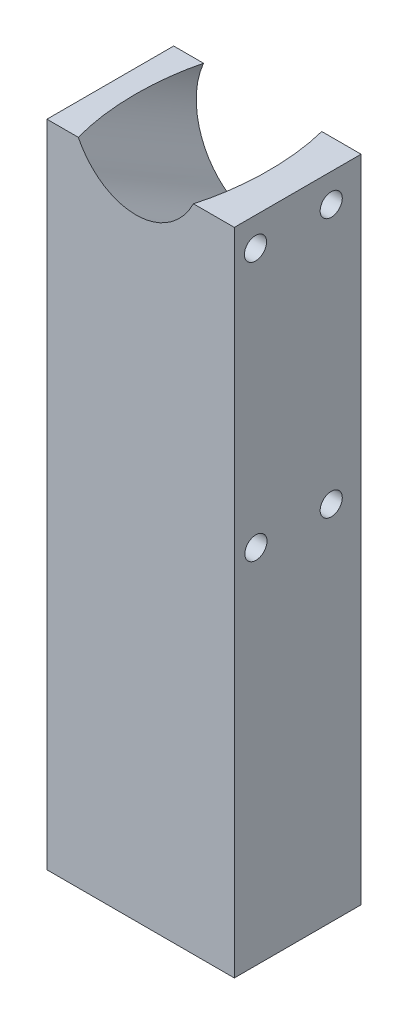
ISO-10303-21;
HEADER;
FILE_DESCRIPTION(('STEP AP214'),'2;1');
FILE_NAME('part.step','',(''),(''),'','','');
FILE_SCHEMA(('AUTOMOTIVE_DESIGN { 1 0 10303 214 1 1 1 1 }'));
ENDSEC;
DATA;
#1=APPLICATION_CONTEXT('core data for automotive mechanical design processes');
#2=APPLICATION_PROTOCOL_DEFINITION('international standard','automotive_design',2000,#1);
#3=PRODUCT_CONTEXT('',#1,'mechanical');
#4=PRODUCT('Part','Part','',(#3));
#5=PRODUCT_RELATED_PRODUCT_CATEGORY('part','',(#4));
#6=PRODUCT_DEFINITION_FORMATION('','',#4);
#7=PRODUCT_DEFINITION_CONTEXT('part definition',#1,'design');
#8=PRODUCT_DEFINITION('design','',#6,#7);
#9=PRODUCT_DEFINITION_SHAPE('','',#8);
#10=(LENGTH_UNIT() NAMED_UNIT(*) SI_UNIT(.MILLI.,.METRE.));
#11=(NAMED_UNIT(*) PLANE_ANGLE_UNIT() SI_UNIT($,.RADIAN.));
#12=(NAMED_UNIT(*) SI_UNIT($,.STERADIAN.) SOLID_ANGLE_UNIT());
#13=UNCERTAINTY_MEASURE_WITH_UNIT(LENGTH_MEASURE(1.E-05),#10,'distance_accuracy_value','');
#14=(GEOMETRIC_REPRESENTATION_CONTEXT(3) GLOBAL_UNCERTAINTY_ASSIGNED_CONTEXT((#13)) GLOBAL_UNIT_ASSIGNED_CONTEXT((#10,
#11,#12)) REPRESENTATION_CONTEXT('',''));
#15=CARTESIAN_POINT('',(0.,0.,0.));
#16=DIRECTION('',(0.,0.,1.));
#17=DIRECTION('',(1.,0.,0.));
#18=AXIS2_PLACEMENT_3D('',#15,#16,#17);
#19=CARTESIAN_POINT('',(4691.55444195582,-4349.73956554871,53.2520183883639));
#20=DIRECTION('',(-1.,0.,0.));
#21=DIRECTION('',(0.,1.,0.));
#22=AXIS2_PLACEMENT_3D('',#19,#20,#21);
#23=PLANE('',#22);
#24=CARTESIAN_POINT('',(4691.55444195582,-4349.73956554871,53.2520183883639));
#25=DIRECTION('',(1.,0.,0.));
#26=DIRECTION('',(0.,1.,0.));
#27=AXIS2_PLACEMENT_3D('',#24,#25,#26);
#28=CIRCLE('',#27,1.50000000000031);
#29=CARTESIAN_POINT('',(4691.55444195582,-4348.23956554871,53.2520183883639));
#30=VERTEX_POINT('',#29);
#31=EDGE_CURVE('E145',#30,#30,#28,.T.);
#32=ORIENTED_EDGE('',*,*,#31,.F.);
#33=EDGE_LOOP('',(#32));
#34=FACE_BOUND('',#33,.T.);
#35=ADVANCED_FACE('F34',(#34),#23,.T.);
#36=CARTESIAN_POINT('',(4691.55444195582,-4349.73956554871,43.0468273602777));
#37=DIRECTION('',(-1.,0.,0.));
#38=DIRECTION('',(0.,1.,0.));
#39=AXIS2_PLACEMENT_3D('',#36,#37,#38);
#40=PLANE('',#39);
#41=CARTESIAN_POINT('',(4691.55444195582,-4349.73956554871,43.0468273602777));
#42=DIRECTION('',(1.,0.,0.));
#43=DIRECTION('',(0.,1.,0.));
#44=AXIS2_PLACEMENT_3D('',#41,#42,#43);
#45=CIRCLE('',#44,1.50000000000004);
#46=CARTESIAN_POINT('',(4691.55444195582,-4348.23956554871,43.0468273602777));
#47=VERTEX_POINT('',#46);
#48=EDGE_CURVE('E99',#47,#47,#45,.T.);
#49=ORIENTED_EDGE('',*,*,#48,.F.);
#50=EDGE_LOOP('',(#49));
#51=FACE_BOUND('',#50,.T.);
#52=ADVANCED_FACE('F194',(#51),#40,.T.);
#53=CARTESIAN_POINT('',(4696.55444195582,-4384.90256348358,53.2520183883639));
#54=DIRECTION('',(-1.,0.,0.));
#55=DIRECTION('',(0.,1.,0.));
#56=AXIS2_PLACEMENT_3D('',#53,#54,#55);
#57=PLANE('',#56);
#58=CARTESIAN_POINT('',(4696.55444195582,-4384.90256348358,53.2520183883639));
#59=DIRECTION('',(1.,0.,0.));
#60=DIRECTION('',(0.,1.,0.));
#61=AXIS2_PLACEMENT_3D('',#58,#59,#60);
#62=CIRCLE('',#61,1.49999999999993);
#63=CARTESIAN_POINT('',(4696.55444195582,-4383.40256348358,53.2520183883639));
#64=VERTEX_POINT('',#63);
#65=EDGE_CURVE('E128',#64,#64,#62,.T.);
#66=ORIENTED_EDGE('',*,*,#65,.F.);
#67=EDGE_LOOP('',(#66));
#68=FACE_BOUND('',#67,.T.);
#69=ADVANCED_FACE('F196',(#68),#57,.T.);
#70=CARTESIAN_POINT('',(4696.55444195582,-4384.90256348358,43.0468273602777));
#71=DIRECTION('',(-1.,0.,0.));
#72=DIRECTION('',(0.,1.,0.));
#73=AXIS2_PLACEMENT_3D('',#70,#71,#72);
#74=PLANE('',#73);
#75=CARTESIAN_POINT('',(4696.55444195582,-4384.90256348358,43.0468273602777));
#76=DIRECTION('',(1.,0.,0.));
#77=DIRECTION('',(0.,1.,0.));
#78=AXIS2_PLACEMENT_3D('',#75,#76,#77);
#79=CIRCLE('',#78,1.50000000000008);
#80=CARTESIAN_POINT('',(4696.55444195582,-4383.40256348358,43.0468273602777));
#81=VERTEX_POINT('',#80);
#82=EDGE_CURVE('E161',#81,#81,#79,.T.);
#83=ORIENTED_EDGE('',*,*,#82,.F.);
#84=EDGE_LOOP('',(#83));
#85=FACE_BOUND('',#84,.T.);
#86=ADVANCED_FACE('F202',(#85),#74,.T.);
#87=CARTESIAN_POINT('',(4710.95444195582,-4349.73956554871,53.3144563773744));
#88=DIRECTION('',(1.,0.,0.));
#89=DIRECTION('',(0.,-1.,0.));
#90=AXIS2_PLACEMENT_3D('',#87,#88,#89);
#91=PLANE('',#90);
#92=CARTESIAN_POINT('',(4710.95444195582,-4349.73956554871,53.3144563773744));
#93=DIRECTION('',(-1.,0.,0.));
#94=DIRECTION('',(0.,-1.,0.));
#95=AXIS2_PLACEMENT_3D('',#92,#93,#94);
#96=CIRCLE('',#95,1.49999999999987);
#97=CARTESIAN_POINT('',(4710.95444195582,-4351.23956554871,53.3144563773744));
#98=VERTEX_POINT('',#97);
#99=EDGE_CURVE('E139',#98,#98,#96,.T.);
#100=ORIENTED_EDGE('',*,*,#99,.F.);
#101=EDGE_LOOP('',(#100));
#102=FACE_BOUND('',#101,.T.);
#103=ADVANCED_FACE('F244',(#102),#91,.T.);
#104=CARTESIAN_POINT('',(4710.95444195582,-4349.73956554871,43.0468273602777));
#105=DIRECTION('',(1.,0.,0.));
#106=DIRECTION('',(0.,-1.,0.));
#107=AXIS2_PLACEMENT_3D('',#104,#105,#106);
#108=PLANE('',#107);
#109=CARTESIAN_POINT('',(4710.95444195582,-4349.73956554871,43.0468273602777));
#110=DIRECTION('',(-1.,0.,0.));
#111=DIRECTION('',(0.,-1.,0.));
#112=AXIS2_PLACEMENT_3D('',#109,#110,#111);
#113=CIRCLE('',#112,1.50000000000009);
#114=CARTESIAN_POINT('',(4710.95444195582,-4351.23956554871,43.0468273602777));
#115=VERTEX_POINT('',#114);
#116=EDGE_CURVE('E147',#115,#115,#113,.T.);
#117=ORIENTED_EDGE('',*,*,#116,.F.);
#118=EDGE_LOOP('',(#117));
#119=FACE_BOUND('',#118,.T.);
#120=ADVANCED_FACE('F247',(#119),#108,.T.);
#121=CARTESIAN_POINT('',(4705.95444195582,-4384.90256348358,43.0468273602777));
#122=DIRECTION('',(1.,0.,0.));
#123=DIRECTION('',(0.,-1.,0.));
#124=AXIS2_PLACEMENT_3D('',#121,#122,#123);
#125=PLANE('',#124);
#126=CARTESIAN_POINT('',(4705.95444195582,-4384.90256348358,43.0468273602777));
#127=DIRECTION('',(-1.,0.,0.));
#128=DIRECTION('',(0.,-1.,0.));
#129=AXIS2_PLACEMENT_3D('',#126,#127,#128);
#130=CIRCLE('',#129,1.50000000000002);
#131=CARTESIAN_POINT('',(4705.95444195582,-4386.40256348358,43.0468273602777));
#132=VERTEX_POINT('',#131);
#133=EDGE_CURVE('E121',#132,#132,#130,.T.);
#134=ORIENTED_EDGE('',*,*,#133,.F.);
#135=EDGE_LOOP('',(#134));
#136=FACE_BOUND('',#135,.T.);
#137=ADVANCED_FACE('F256',(#136),#125,.T.);
#138=CARTESIAN_POINT('',(4705.95444195582,-4384.90256348358,53.2520183883639));
#139=DIRECTION('',(1.,0.,0.));
#140=DIRECTION('',(0.,-1.,0.));
#141=AXIS2_PLACEMENT_3D('',#138,#139,#140);
#142=PLANE('',#141);
#143=CARTESIAN_POINT('',(4705.95444195582,-4384.90256348358,53.2520183883639));
#144=DIRECTION('',(-1.,0.,0.));
#145=DIRECTION('',(0.,-1.,0.));
#146=AXIS2_PLACEMENT_3D('',#143,#144,#145);
#147=CIRCLE('',#146,1.49999999999989);
#148=CARTESIAN_POINT('',(4705.95444195582,-4386.40256348358,53.2520183883639));
#149=VERTEX_POINT('',#148);
#150=EDGE_CURVE('E131',#149,#149,#147,.T.);
#151=ORIENTED_EDGE('',*,*,#150,.F.);
#152=EDGE_LOOP('',(#151));
#153=FACE_BOUND('',#152,.T.);
#154=ADVANCED_FACE('F241',(#153),#142,.T.);
#155=CARTESIAN_POINT('',(4691.55444195582,-4349.73956554871,53.2520183883639));
#156=DIRECTION('',(-1.,0.,0.));
#157=DIRECTION('',(0.,-1.,0.));
#158=AXIS2_PLACEMENT_3D('',#155,#156,#157);
#159=CYLINDRICAL_SURFACE('',#158,1.50000000000031);
#160=ORIENTED_EDGE('',*,*,#31,.T.);
#161=EDGE_LOOP('',(#160));
#162=FACE_BOUND('',#161,.T.);
#163=CARTESIAN_POINT('',(4689.15444195568,-4349.73956554871,53.2520183883639));
#164=DIRECTION('',(1.,0.,0.));
#165=DIRECTION('',(0.,1.,0.));
#166=AXIS2_PLACEMENT_3D('',#163,#164,#165);
#167=CIRCLE('',#166,1.50000000000031);
#168=CARTESIAN_POINT('',(4689.15444195568,-4348.23956554871,53.2520183883639));
#169=VERTEX_POINT('',#168);
#170=EDGE_CURVE('E144',#169,#169,#167,.F.);
#171=ORIENTED_EDGE('',*,*,#170,.T.);
#172=EDGE_LOOP('',(#171));
#173=FACE_BOUND('',#172,.T.);
#174=ADVANCED_FACE('F233',(#162,#173),#159,.F.);
#175=CARTESIAN_POINT('',(4691.55444195582,-4349.73956554871,43.0468273602777));
#176=DIRECTION('',(-1.,0.,0.));
#177=DIRECTION('',(0.,-1.,0.));
#178=AXIS2_PLACEMENT_3D('',#175,#176,#177);
#179=CYLINDRICAL_SURFACE('',#178,1.50000000000004);
#180=ORIENTED_EDGE('',*,*,#48,.T.);
#181=EDGE_LOOP('',(#180));
#182=FACE_BOUND('',#181,.T.);
#183=CARTESIAN_POINT('',(4689.15444195568,-4349.73956554871,43.0468273602777));
#184=DIRECTION('',(1.,0.,0.));
#185=DIRECTION('',(0.,1.,0.));
#186=AXIS2_PLACEMENT_3D('',#183,#184,#185);
#187=CIRCLE('',#186,1.50000000000004);
#188=CARTESIAN_POINT('',(4689.15444195568,-4348.23956554871,43.0468273602777));
#189=VERTEX_POINT('',#188);
#190=EDGE_CURVE('E142',#189,#189,#187,.F.);
#191=ORIENTED_EDGE('',*,*,#190,.T.);
#192=EDGE_LOOP('',(#191));
#193=FACE_BOUND('',#192,.T.);
#194=ADVANCED_FACE('F191',(#182,#193),#179,.F.);
#195=CARTESIAN_POINT('',(4673.55444195582,-4384.90256348358,53.2520183883639));
#196=DIRECTION('',(1.,0.,0.));
#197=DIRECTION('',(0.,1.,0.));
#198=AXIS2_PLACEMENT_3D('',#195,#196,#197);
#199=CYLINDRICAL_SURFACE('',#198,1.49999999999993);
#200=ORIENTED_EDGE('',*,*,#65,.T.);
#201=EDGE_LOOP('',(#200));
#202=FACE_BOUND('',#201,.T.);
#203=CARTESIAN_POINT('',(4689.15444195568,-4384.90256348358,53.2520183883639));
#204=DIRECTION('',(1.,0.,0.));
#205=DIRECTION('',(0.,1.,0.));
#206=AXIS2_PLACEMENT_3D('',#203,#204,#205);
#207=CIRCLE('',#206,1.49999999999993);
#208=CARTESIAN_POINT('',(4689.15444195568,-4383.40256348358,53.2520183883639));
#209=VERTEX_POINT('',#208);
#210=EDGE_CURVE('E127',#209,#209,#207,.T.);
#211=ORIENTED_EDGE('',*,*,#210,.F.);
#212=EDGE_LOOP('',(#211));
#213=FACE_BOUND('',#212,.T.);
#214=ADVANCED_FACE('F232',(#202,#213),#199,.F.);
#215=CARTESIAN_POINT('',(4673.55444195582,-4384.90256348358,43.0468273602777));
#216=DIRECTION('',(1.,0.,0.));
#217=DIRECTION('',(0.,1.,0.));
#218=AXIS2_PLACEMENT_3D('',#215,#216,#217);
#219=CYLINDRICAL_SURFACE('',#218,1.50000000000008);
#220=ORIENTED_EDGE('',*,*,#82,.T.);
#221=EDGE_LOOP('',(#220));
#222=FACE_BOUND('',#221,.T.);
#223=CARTESIAN_POINT('',(4689.15444195568,-4384.90256348358,43.0468273602777));
#224=DIRECTION('',(1.,0.,0.));
#225=DIRECTION('',(0.,1.,0.));
#226=AXIS2_PLACEMENT_3D('',#223,#224,#225);
#227=CIRCLE('',#226,1.50000000000008);
#228=CARTESIAN_POINT('',(4689.15444195568,-4383.40256348358,43.0468273602777));
#229=VERTEX_POINT('',#228);
#230=EDGE_CURVE('E124',#229,#229,#227,.T.);
#231=ORIENTED_EDGE('',*,*,#230,.F.);
#232=EDGE_LOOP('',(#231));
#233=FACE_BOUND('',#232,.T.);
#234=ADVANCED_FACE('F238',(#222,#233),#219,.F.);
#235=CARTESIAN_POINT('',(4716.95444195582,-4349.73956554871,53.3144563773744));
#236=DIRECTION('',(-1.,0.,0.));
#237=DIRECTION('',(0.,-1.,0.));
#238=AXIS2_PLACEMENT_3D('',#235,#236,#237);
#239=CYLINDRICAL_SURFACE('',#238,1.49999999999987);
#240=ORIENTED_EDGE('',*,*,#99,.T.);
#241=EDGE_LOOP('',(#240));
#242=FACE_BOUND('',#241,.T.);
#243=CARTESIAN_POINT('',(4714.55444195569,-4349.73956554871,53.3144563773744));
#244=DIRECTION('',(-1.,0.,0.));
#245=DIRECTION('',(0.,-1.,0.));
#246=AXIS2_PLACEMENT_3D('',#243,#244,#245);
#247=CIRCLE('',#246,1.49999999999987);
#248=CARTESIAN_POINT('',(4714.55444195569,-4351.23956554871,53.3144563773744));
#249=VERTEX_POINT('',#248);
#250=EDGE_CURVE('E138',#249,#249,#247,.T.);
#251=ORIENTED_EDGE('',*,*,#250,.F.);
#252=EDGE_LOOP('',(#251));
#253=FACE_BOUND('',#252,.T.);
#254=ADVANCED_FACE('F249',(#242,#253),#239,.F.);
#255=CARTESIAN_POINT('',(4716.95444195582,-4349.73956554871,43.0468273602777));
#256=DIRECTION('',(-1.,0.,0.));
#257=DIRECTION('',(0.,-1.,0.));
#258=AXIS2_PLACEMENT_3D('',#255,#256,#257);
#259=CYLINDRICAL_SURFACE('',#258,1.50000000000009);
#260=ORIENTED_EDGE('',*,*,#116,.T.);
#261=EDGE_LOOP('',(#260));
#262=FACE_BOUND('',#261,.T.);
#263=CARTESIAN_POINT('',(4714.55444195569,-4349.73956554871,43.0468273602777));
#264=DIRECTION('',(-1.,0.,0.));
#265=DIRECTION('',(0.,-1.,0.));
#266=AXIS2_PLACEMENT_3D('',#263,#264,#265);
#267=CIRCLE('',#266,1.50000000000009);
#268=CARTESIAN_POINT('',(4714.55444195569,-4351.23956554871,43.0468273602777));
#269=VERTEX_POINT('',#268);
#270=EDGE_CURVE('E135',#269,#269,#267,.T.);
#271=ORIENTED_EDGE('',*,*,#270,.F.);
#272=EDGE_LOOP('',(#271));
#273=FACE_BOUND('',#272,.T.);
#274=ADVANCED_FACE('F252',(#262,#273),#259,.F.);
#275=CARTESIAN_POINT('',(4731.64888795786,-4384.90256348358,43.0468273602777));
#276=DIRECTION('',(-1.,0.,0.));
#277=DIRECTION('',(0.,-1.,0.));
#278=AXIS2_PLACEMENT_3D('',#275,#276,#277);
#279=CYLINDRICAL_SURFACE('',#278,1.50000000000002);
#280=ORIENTED_EDGE('',*,*,#133,.T.);
#281=EDGE_LOOP('',(#280));
#282=FACE_BOUND('',#281,.T.);
#283=CARTESIAN_POINT('',(4714.55444195569,-4384.90256348358,43.0468273602777));
#284=DIRECTION('',(-1.,0.,0.));
#285=DIRECTION('',(0.,-1.,0.));
#286=AXIS2_PLACEMENT_3D('',#283,#284,#285);
#287=CIRCLE('',#286,1.50000000000002);
#288=CARTESIAN_POINT('',(4714.55444195569,-4386.40256348358,43.0468273602777));
#289=VERTEX_POINT('',#288);
#290=EDGE_CURVE('E120',#289,#289,#287,.T.);
#291=ORIENTED_EDGE('',*,*,#290,.F.);
#292=EDGE_LOOP('',(#291));
#293=FACE_BOUND('',#292,.T.);
#294=ADVANCED_FACE('F260',(#282,#293),#279,.F.);
#295=CARTESIAN_POINT('',(4731.64888795786,-4384.90256348358,53.2520183883639));
#296=DIRECTION('',(-1.,0.,0.));
#297=DIRECTION('',(0.,-1.,0.));
#298=AXIS2_PLACEMENT_3D('',#295,#296,#297);
#299=CYLINDRICAL_SURFACE('',#298,1.49999999999989);
#300=ORIENTED_EDGE('',*,*,#150,.T.);
#301=EDGE_LOOP('',(#300));
#302=FACE_BOUND('',#301,.T.);
#303=CARTESIAN_POINT('',(4714.55444195569,-4384.90256348358,53.2520183883639));
#304=DIRECTION('',(-1.,0.,0.));
#305=DIRECTION('',(0.,-1.,0.));
#306=AXIS2_PLACEMENT_3D('',#303,#304,#305);
#307=CIRCLE('',#306,1.49999999999989);
#308=CARTESIAN_POINT('',(4714.55444195569,-4386.40256348358,53.2520183883639));
#309=VERTEX_POINT('',#308);
#310=EDGE_CURVE('E117',#309,#309,#307,.T.);
#311=ORIENTED_EDGE('',*,*,#310,.F.);
#312=EDGE_LOOP('',(#311));
#313=FACE_BOUND('',#312,.T.);
#314=ADVANCED_FACE('F276',(#302,#313),#299,.F.);
#315=CARTESIAN_POINT('',(4640.66193548388,-4345.85806451614,10.7710006429907));
#316=DIRECTION('',(0.,-1.,0.));
#317=DIRECTION('',(0.,0.,1.));
#318=AXIS2_PLACEMENT_3D('',#315,#316,#317);
#319=PLANE('',#318);
#320=CARTESIAN_POINT('',(4701.21390972028,-4345.85806451614,47.2002877218144));
#321=DIRECTION('',(0.,-1.,0.));
#322=DIRECTION('',(0.,0.,1.));
#323=AXIS2_PLACEMENT_3D('',#320,#321,#322);
#324=ELLIPSE('',#323,18.0000000000008,9.00000000000035);
#325=CARTESIAN_POINT('',(4693.20211714185,-4345.85806451614,39.0000000000001));
#326=VERTEX_POINT('',#325);
#327=CARTESIAN_POINT('',(4693.41400383613,-4345.85806451614,56.1805924378812));
#328=VERTEX_POINT('',#327);
#329=EDGE_CURVE('E132',#326,#328,#324,.F.);
#330=ORIENTED_EDGE('',*,*,#329,.F.);
#331=DIRECTION('',(1.,0.,0.));
#332=VECTOR('',#331,1.);
#333=CARTESIAN_POINT('',(4714.55444195569,-4345.85806451614,39.0000000000001));
#334=LINE('',#333,#332);
#335=CARTESIAN_POINT('',(4689.15444195568,-4345.85806451614,39.));
#336=VERTEX_POINT('',#335);
#337=EDGE_CURVE('E134',#336,#326,#334,.T.);
#338=ORIENTED_EDGE('',*,*,#337,.F.);
#339=DIRECTION('',(0.,0.,-1.));
#340=VECTOR('',#339,1.);
#341=CARTESIAN_POINT('',(4689.15444195568,-4345.85806451614,39.0000000000001));
#342=LINE('',#341,#340);
#343=CARTESIAN_POINT('',(4689.15444195568,-4345.85806451614,56.1805924378812));
#344=VERTEX_POINT('',#343);
#345=EDGE_CURVE('E173',#344,#336,#342,.T.);
#346=ORIENTED_EDGE('',*,*,#345,.F.);
#347=DIRECTION('',(-1.,0.,0.));
#348=VECTOR('',#347,1.);
#349=CARTESIAN_POINT('',(4714.55444195569,-4345.85806451614,56.1805924378812));
#350=LINE('',#349,#348);
#351=EDGE_CURVE('E105',#328,#344,#350,.T.);
#352=ORIENTED_EDGE('',*,*,#351,.F.);
#353=EDGE_LOOP('',(#330,#338,#346,#352));
#354=FACE_BOUND('',#353,.T.);
#355=ADVANCED_FACE('F263',(#354),#319,.F.);
#356=CARTESIAN_POINT('',(4701.21390972028,-4424.96947850723,-89.8247007693626));
#357=DIRECTION('',(0.,0.499999999999998,0.86602540378444));
#358=DIRECTION('',(0.,-0.86602540378444,0.499999999999998));
#359=AXIS2_PLACEMENT_3D('',#356,#357,#358);
#360=CYLINDRICAL_SURFACE('',#359,9.00000000000035);
#361=CARTESIAN_POINT('',(4709.01381560444,-4345.85806451614,56.1805924378812));
#362=VERTEX_POINT('',#361);
#363=CARTESIAN_POINT('',(4709.22570229872,-4345.85806451614,39.0000000000001));
#364=VERTEX_POINT('',#363);
#365=EDGE_CURVE('E42',#362,#364,#324,.F.);
#366=ORIENTED_EDGE('',*,*,#365,.T.);
#367=CARTESIAN_POINT('',(4701.21390972028,-4350.59250283977,39.0000000000001));
#368=DIRECTION('',(0.,0.,1.));
#369=DIRECTION('',(0.,1.,0.));
#370=AXIS2_PLACEMENT_3D('',#367,#368,#369);
#371=ELLIPSE('',#370,10.3923048454137,9.00000000000035);
#372=EDGE_CURVE('E56',#364,#326,#371,.F.);
#373=ORIENTED_EDGE('',*,*,#372,.T.);
#374=ORIENTED_EDGE('',*,*,#329,.T.);
#375=CARTESIAN_POINT('',(4701.21390972028,-4340.67328317092,56.1805924378812));
#376=DIRECTION('',(0.,0.,-1.));
#377=DIRECTION('',(0.,1.,0.));
#378=AXIS2_PLACEMENT_3D('',#375,#376,#377);
#379=ELLIPSE('',#378,10.3923048454137,9.00000000000035);
#380=EDGE_CURVE('E159',#328,#362,#379,.F.);
#381=ORIENTED_EDGE('',*,*,#380,.T.);
#382=EDGE_LOOP('',(#366,#373,#374,#381));
#383=FACE_BOUND('',#382,.T.);
#384=ADVANCED_FACE('F261',(#383),#360,.F.);
#385=ORIENTED_EDGE('',*,*,#365,.F.);
#386=CARTESIAN_POINT('',(4714.55444195569,-4345.85806451614,56.1805924378812));
#387=VERTEX_POINT('',#386);
#388=EDGE_CURVE('E170',#387,#362,#350,.T.);
#389=ORIENTED_EDGE('',*,*,#388,.F.);
#390=DIRECTION('',(0.,0.,1.));
#391=VECTOR('',#390,1.);
#392=CARTESIAN_POINT('',(4714.55444195569,-4345.85806451614,39.0000000000001));
#393=LINE('',#392,#391);
#394=CARTESIAN_POINT('',(4714.55444195569,-4345.85806451614,39.));
#395=VERTEX_POINT('',#394);
#396=EDGE_CURVE('E109',#395,#387,#393,.T.);
#397=ORIENTED_EDGE('',*,*,#396,.F.);
#398=EDGE_CURVE('E175',#364,#395,#334,.T.);
#399=ORIENTED_EDGE('',*,*,#398,.F.);
#400=EDGE_LOOP('',(#385,#389,#397,#399));
#401=FACE_BOUND('',#400,.T.);
#402=ADVANCED_FACE('F223',(#401),#319,.F.);
#403=CARTESIAN_POINT('',(4714.55444195569,-4315.19321890237,39.0000000000001));
#404=DIRECTION('',(-1.,0.,0.));
#405=DIRECTION('',(0.,-1.,0.));
#406=AXIS2_PLACEMENT_3D('',#403,#404,#405);
#407=PLANE('',#406);
#408=ORIENTED_EDGE('',*,*,#310,.T.);
#409=EDGE_LOOP('',(#408));
#410=FACE_BOUND('',#409,.T.);
#411=ORIENTED_EDGE('',*,*,#290,.T.);
#412=EDGE_LOOP('',(#411));
#413=FACE_BOUND('',#412,.T.);
#414=ORIENTED_EDGE('',*,*,#270,.T.);
#415=EDGE_LOOP('',(#414));
#416=FACE_BOUND('',#415,.T.);
#417=ORIENTED_EDGE('',*,*,#250,.T.);
#418=EDGE_LOOP('',(#417));
#419=FACE_BOUND('',#418,.T.);
#420=DIRECTION('',(0.,-1.,0.));
#421=VECTOR('',#420,1.);
#422=CARTESIAN_POINT('',(4714.55444195569,-4315.19321890237,56.1805924378812));
#423=LINE('',#422,#421);
#424=CARTESIAN_POINT('',(4714.55444195569,-4433.96770812318,56.1805924378812));
#425=VERTEX_POINT('',#424);
#426=EDGE_CURVE('E107',#387,#425,#423,.T.);
#427=ORIENTED_EDGE('',*,*,#426,.T.);
#428=DIRECTION('',(0.,0.,-1.));
#429=VECTOR('',#428,1.);
#430=CARTESIAN_POINT('',(4714.55444195569,-4433.96770812318,39.0000000000001));
#431=LINE('',#430,#429);
#432=CARTESIAN_POINT('',(4714.55444195569,-4433.96770812318,39.));
#433=VERTEX_POINT('',#432);
#434=EDGE_CURVE('E49',#425,#433,#431,.T.);
#435=ORIENTED_EDGE('',*,*,#434,.T.);
#436=DIRECTION('',(0.,-1.,0.));
#437=VECTOR('',#436,1.);
#438=CARTESIAN_POINT('',(4714.55444195569,-4315.19321890237,39.0000000000001));
#439=LINE('',#438,#437);
#440=EDGE_CURVE('E111',#395,#433,#439,.T.);
#441=ORIENTED_EDGE('',*,*,#440,.F.);
#442=ORIENTED_EDGE('',*,*,#396,.T.);
#443=EDGE_LOOP('',(#427,#435,#441,#442));
#444=FACE_BOUND('',#443,.T.);
#445=ADVANCED_FACE('F183',(#410,#413,#416,#419,#444),#407,.F.);
#446=CARTESIAN_POINT('',(4689.15444195568,-4315.19321890237,39.0000000000001));
#447=DIRECTION('',(1.,0.,0.));
#448=DIRECTION('',(0.,1.,0.));
#449=AXIS2_PLACEMENT_3D('',#446,#447,#448);
#450=PLANE('',#449);
#451=ORIENTED_EDGE('',*,*,#230,.T.);
#452=EDGE_LOOP('',(#451));
#453=FACE_BOUND('',#452,.T.);
#454=ORIENTED_EDGE('',*,*,#210,.T.);
#455=EDGE_LOOP('',(#454));
#456=FACE_BOUND('',#455,.T.);
#457=ORIENTED_EDGE('',*,*,#190,.F.);
#458=EDGE_LOOP('',(#457));
#459=FACE_BOUND('',#458,.T.);
#460=ORIENTED_EDGE('',*,*,#170,.F.);
#461=EDGE_LOOP('',(#460));
#462=FACE_BOUND('',#461,.T.);
#463=DIRECTION('',(0.,-1.,0.));
#464=VECTOR('',#463,1.);
#465=CARTESIAN_POINT('',(4689.15444195568,-4315.19321890237,39.0000000000001));
#466=LINE('',#465,#464);
#467=CARTESIAN_POINT('',(4689.15444195568,-4433.96770812318,39.));
#468=VERTEX_POINT('',#467);
#469=EDGE_CURVE('E98',#336,#468,#466,.T.);
#470=ORIENTED_EDGE('',*,*,#469,.T.);
#471=DIRECTION('',(0.,0.,1.));
#472=VECTOR('',#471,1.);
#473=CARTESIAN_POINT('',(4689.15444195568,-4433.96770812318,39.0000000000001));
#474=LINE('',#473,#472);
#475=CARTESIAN_POINT('',(4689.15444195568,-4433.96770812318,56.1805924378833));
#476=VERTEX_POINT('',#475);
#477=EDGE_CURVE('E85',#468,#476,#474,.T.);
#478=ORIENTED_EDGE('',*,*,#477,.T.);
#479=DIRECTION('',(0.,-1.,0.));
#480=VECTOR('',#479,1.);
#481=CARTESIAN_POINT('',(4689.15444195568,-4315.19321890237,56.1805924378812));
#482=LINE('',#481,#480);
#483=EDGE_CURVE('E96',#344,#476,#482,.T.);
#484=ORIENTED_EDGE('',*,*,#483,.F.);
#485=ORIENTED_EDGE('',*,*,#345,.T.);
#486=EDGE_LOOP('',(#470,#478,#484,#485));
#487=FACE_BOUND('',#486,.T.);
#488=ADVANCED_FACE('F94',(#453,#456,#459,#462,#487),#450,.F.);
#489=CARTESIAN_POINT('',(4714.55444195569,-4315.19321890237,39.0000000000001));
#490=DIRECTION('',(0.,0.,1.));
#491=DIRECTION('',(0.,-1.,0.));
#492=AXIS2_PLACEMENT_3D('',#489,#490,#491);
#493=PLANE('',#492);
#494=ORIENTED_EDGE('',*,*,#440,.T.);
#495=DIRECTION('',(-1.,0.,0.));
#496=VECTOR('',#495,1.);
#497=CARTESIAN_POINT('',(4714.55444195569,-4433.96770812318,39.));
#498=LINE('',#497,#496);
#499=EDGE_CURVE('E100',#433,#468,#498,.T.);
#500=ORIENTED_EDGE('',*,*,#499,.T.);
#501=ORIENTED_EDGE('',*,*,#469,.F.);
#502=ORIENTED_EDGE('',*,*,#337,.T.);
#503=ORIENTED_EDGE('',*,*,#372,.F.);
#504=ORIENTED_EDGE('',*,*,#398,.T.);
#505=EDGE_LOOP('',(#494,#500,#501,#502,#503,#504));
#506=FACE_BOUND('',#505,.T.);
#507=ADVANCED_FACE('F36',(#506),#493,.F.);
#508=CARTESIAN_POINT('',(4716.26950221952,-4433.96770812318,11.6703669037885));
#509=DIRECTION('',(0.,1.,0.));
#510=DIRECTION('',(0.,0.,1.));
#511=AXIS2_PLACEMENT_3D('',#508,#509,#510);
#512=PLANE('',#511);
#513=ORIENTED_EDGE('',*,*,#499,.F.);
#514=ORIENTED_EDGE('',*,*,#434,.F.);
#515=DIRECTION('',(1.,0.,0.));
#516=VECTOR('',#515,1.);
#517=CARTESIAN_POINT('',(4714.55444195569,-4433.96770812318,56.1805924378812));
#518=LINE('',#517,#516);
#519=EDGE_CURVE('E11',#476,#425,#518,.T.);
#520=ORIENTED_EDGE('',*,*,#519,.F.);
#521=ORIENTED_EDGE('',*,*,#477,.F.);
#522=EDGE_LOOP('',(#513,#514,#520,#521));
#523=FACE_BOUND('',#522,.T.);
#524=ADVANCED_FACE('F84',(#523),#512,.F.);
#525=CARTESIAN_POINT('',(4714.55444195569,-4315.19321890237,56.1805924378812));
#526=DIRECTION('',(0.,0.,-1.));
#527=DIRECTION('',(0.,1.,0.));
#528=AXIS2_PLACEMENT_3D('',#525,#526,#527);
#529=PLANE('',#528);
#530=ORIENTED_EDGE('',*,*,#483,.T.);
#531=ORIENTED_EDGE('',*,*,#519,.T.);
#532=ORIENTED_EDGE('',*,*,#426,.F.);
#533=ORIENTED_EDGE('',*,*,#388,.T.);
#534=ORIENTED_EDGE('',*,*,#380,.F.);
#535=ORIENTED_EDGE('',*,*,#351,.T.);
#536=EDGE_LOOP('',(#530,#531,#532,#533,#534,#535));
#537=FACE_BOUND('',#536,.T.);
#538=ADVANCED_FACE('F102',(#537),#529,.F.);
#539=CLOSED_SHELL('',(#35,#52,#69,#86,#103,#120,#137,#154,#174,#194,#214,#234,#254,#274,#294,
#314,#355,#384,#402,#445,#488,#507,#524,#538));
#540=MANIFOLD_SOLID_BREP('B2',#539);
#541=ADVANCED_BREP_SHAPE_REPRESENTATION('',(#18,#540),#14);
#542=SHAPE_DEFINITION_REPRESENTATION(#9,#541);
ENDSEC;
END-ISO-10303-21;
